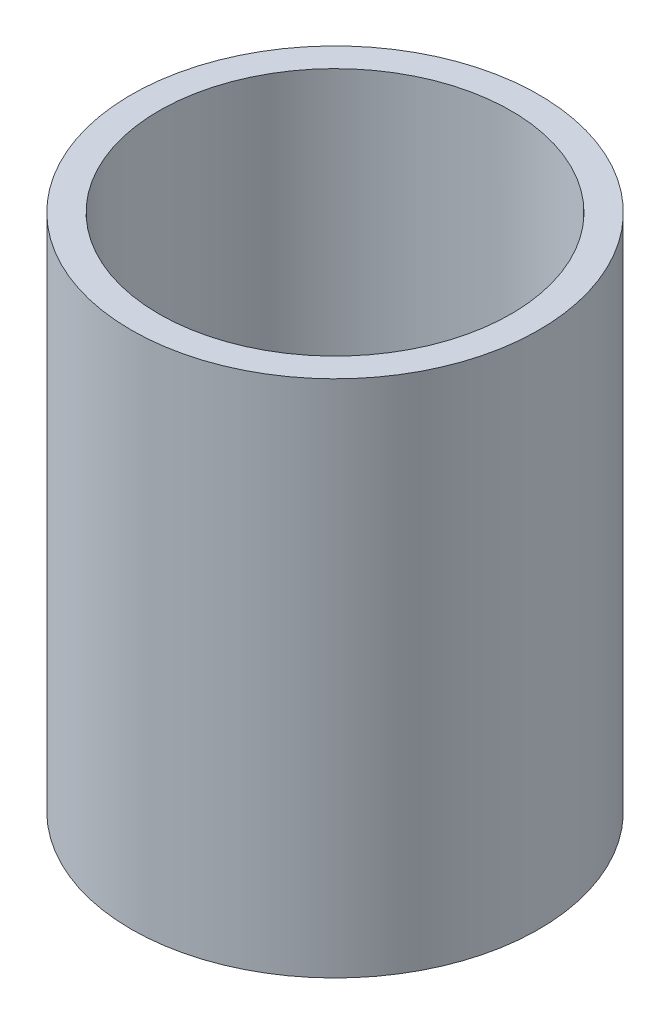
ISO-10303-21;
HEADER;
FILE_DESCRIPTION(('STEP AP214'),'2;1');
FILE_NAME('part.step','',(''),(''),'','','');
FILE_SCHEMA(('AUTOMOTIVE_DESIGN { 1 0 10303 214 1 1 1 1 }'));
ENDSEC;
DATA;
#1=APPLICATION_CONTEXT('core data for automotive mechanical design processes');
#2=APPLICATION_PROTOCOL_DEFINITION('international standard','automotive_design',2000,#1);
#3=PRODUCT_CONTEXT('',#1,'mechanical');
#4=PRODUCT('Part','Part','',(#3));
#5=PRODUCT_RELATED_PRODUCT_CATEGORY('part','',(#4));
#6=PRODUCT_DEFINITION_FORMATION('','',#4);
#7=PRODUCT_DEFINITION_CONTEXT('part definition',#1,'design');
#8=PRODUCT_DEFINITION('design','',#6,#7);
#9=PRODUCT_DEFINITION_SHAPE('','',#8);
#10=(LENGTH_UNIT() NAMED_UNIT(*) SI_UNIT(.MILLI.,.METRE.));
#11=(NAMED_UNIT(*) PLANE_ANGLE_UNIT() SI_UNIT($,.RADIAN.));
#12=(NAMED_UNIT(*) SI_UNIT($,.STERADIAN.) SOLID_ANGLE_UNIT());
#13=UNCERTAINTY_MEASURE_WITH_UNIT(LENGTH_MEASURE(1.E-05),#10,'distance_accuracy_value','');
#14=(GEOMETRIC_REPRESENTATION_CONTEXT(3) GLOBAL_UNCERTAINTY_ASSIGNED_CONTEXT((#13)) GLOBAL_UNIT_ASSIGNED_CONTEXT((#10,
#11,#12)) REPRESENTATION_CONTEXT('',''));
#15=CARTESIAN_POINT('',(0.,0.,0.));
#16=DIRECTION('',(0.,0.,1.));
#17=DIRECTION('',(1.,0.,0.));
#18=AXIS2_PLACEMENT_3D('',#15,#16,#17);
#19=CARTESIAN_POINT('',(0.,14.,0.));
#20=DIRECTION('',(0.,1.,0.));
#21=DIRECTION('',(0.,0.,1.));
#22=AXIS2_PLACEMENT_3D('',#19,#20,#21);
#23=PLANE('',#22);
#24=CARTESIAN_POINT('',(0.,14.,0.));
#25=DIRECTION('',(0.,1.,0.));
#26=DIRECTION('',(0.,0.,1.));
#27=AXIS2_PLACEMENT_3D('',#24,#25,#26);
#28=CIRCLE('',#27,11.);
#29=CARTESIAN_POINT('',(0.,14.,11.));
#30=VERTEX_POINT('',#29);
#31=EDGE_CURVE('E10',#30,#30,#28,.T.);
#32=ORIENTED_EDGE('',*,*,#31,.T.);
#33=EDGE_LOOP('',(#32));
#34=FACE_BOUND('',#33,.T.);
#35=CARTESIAN_POINT('',(0.,14.,0.));
#36=DIRECTION('',(0.,1.,0.));
#37=DIRECTION('',(0.,0.,1.));
#38=AXIS2_PLACEMENT_3D('',#35,#36,#37);
#39=CIRCLE('',#38,9.5);
#40=CARTESIAN_POINT('',(0.,14.,9.5));
#41=VERTEX_POINT('',#40);
#42=EDGE_CURVE('E50',#41,#41,#39,.T.);
#43=ORIENTED_EDGE('',*,*,#42,.F.);
#44=EDGE_LOOP('',(#43));
#45=FACE_BOUND('',#44,.T.);
#46=ADVANCED_FACE('F31',(#34,#45),#23,.T.);
#47=CARTESIAN_POINT('',(0.,-14.,0.));
#48=DIRECTION('',(0.,1.,0.));
#49=DIRECTION('',(0.,0.,1.));
#50=AXIS2_PLACEMENT_3D('',#47,#48,#49);
#51=PLANE('',#50);
#52=CARTESIAN_POINT('',(0.,-14.,0.));
#53=DIRECTION('',(0.,1.,0.));
#54=DIRECTION('',(0.,0.,1.));
#55=AXIS2_PLACEMENT_3D('',#52,#53,#54);
#56=CIRCLE('',#55,11.);
#57=CARTESIAN_POINT('',(0.,-14.,11.));
#58=VERTEX_POINT('',#57);
#59=EDGE_CURVE('E45',#58,#58,#56,.T.);
#60=ORIENTED_EDGE('',*,*,#59,.F.);
#61=EDGE_LOOP('',(#60));
#62=FACE_BOUND('',#61,.T.);
#63=CARTESIAN_POINT('',(0.,-14.,0.));
#64=DIRECTION('',(0.,1.,0.));
#65=DIRECTION('',(0.,0.,1.));
#66=AXIS2_PLACEMENT_3D('',#63,#64,#65);
#67=CIRCLE('',#66,9.5);
#68=CARTESIAN_POINT('',(0.,-14.,9.5));
#69=VERTEX_POINT('',#68);
#70=EDGE_CURVE('E52',#69,#69,#67,.T.);
#71=ORIENTED_EDGE('',*,*,#70,.T.);
#72=EDGE_LOOP('',(#71));
#73=FACE_BOUND('',#72,.T.);
#74=ADVANCED_FACE('F73',(#62,#73),#51,.F.);
#75=CARTESIAN_POINT('',(0.,14.,0.));
#76=DIRECTION('',(0.,-1.,0.));
#77=DIRECTION('',(0.,0.,-1.));
#78=AXIS2_PLACEMENT_3D('',#75,#76,#77);
#79=CYLINDRICAL_SURFACE('',#78,11.);
#80=CARTESIAN_POINT('',(0.,2.,-11.));
#81=CARTESIAN_POINT('',(-0.111357271644373,1.99999568133932,-10.9999980072786));
#82=CARTESIAN_POINT('',(-0.222771449918202,1.99066824251735,-10.9982915273343));
#83=CARTESIAN_POINT('',(-0.442464406848309,1.95362653397508,-10.99164847502));
#84=CARTESIAN_POINT('',(-0.550740387266074,1.92589635141863,-10.9867091072254));
#85=CARTESIAN_POINT('',(-0.760947572513747,1.85292287032901,-10.9741532323507));
#86=CARTESIAN_POINT('',(-0.862884263930176,1.80769496781024,-10.9665390793192));
#87=CARTESIAN_POINT('',(-1.0577120033845,1.70105266880821,-10.949466714983));
#88=CARTESIAN_POINT('',(-1.15060386767904,1.63963973481181,-10.9400086703132));
#89=CARTESIAN_POINT('',(-1.32576444051238,1.50163409035729,-10.9201743349983));
#90=CARTESIAN_POINT('',(-1.40791622603346,1.42489415801924,-10.9097897259708));
#91=CARTESIAN_POINT('',(-1.55825357341079,1.25872964591017,-10.8893349521181));
#92=CARTESIAN_POINT('',(-1.62643816794977,1.16930418831085,-10.8792648091126));
#93=CARTESIAN_POINT('',(-1.74738695016477,0.979487270540227,-10.8604984020977));
#94=CARTESIAN_POINT('',(-1.80003313265556,0.879019464769625,-10.851812871101));
#95=CARTESIAN_POINT('',(-1.88765546949978,0.670481349676033,-10.836915832769));
#96=CARTESIAN_POINT('',(-1.92263305283275,0.562411655974962,-10.8307041253674));
#97=CARTESIAN_POINT('',(-1.97355197711315,0.342985350643402,-10.8215415351671));
#98=CARTESIAN_POINT('',(-1.98969666425445,0.231677408290375,-10.8185558462234));
#99=CARTESIAN_POINT('',(-2.00312248736688,0.0078955926854322,-10.8160783143231));
#100=CARTESIAN_POINT('',(-2.00040521296643,-0.104578181516031,-10.8165861769405));
#101=CARTESIAN_POINT('',(-1.97634934427,-0.326031914133018,-10.8210066504918));
#102=CARTESIAN_POINT('',(-1.95524117699072,-0.435037867895722,-10.8248771281426));
#103=CARTESIAN_POINT('',(-1.89536523340026,-0.647935018367165,-10.8355206127391));
#104=CARTESIAN_POINT('',(-1.85659674743188,-0.75182600935179,-10.8422937363232));
#105=CARTESIAN_POINT('',(-1.76227297789295,-0.952222790778736,-10.8580238155272));
#106=CARTESIAN_POINT('',(-1.7066239037154,-1.04868344266613,-10.8669929171435));
#107=CARTESIAN_POINT('',(-1.58018503374043,-1.23098473694529,-10.8860962201172));
#108=CARTESIAN_POINT('',(-1.50939379023584,-1.31682436264624,-10.8962305328347));
#109=CARTESIAN_POINT('',(-1.35343399418352,-1.47677899644437,-10.9167064080854));
#110=CARTESIAN_POINT('',(-1.2680681726569,-1.55070168843691,-10.9270488181647));
#111=CARTESIAN_POINT('',(-1.08604454069331,-1.68320513348083,-10.9466375043709));
#112=CARTESIAN_POINT('',(-0.989386629498157,-1.74178574962126,-10.9558837707156));
#113=CARTESIAN_POINT('',(-0.787327598497296,-1.84196738978503,-10.9722553782534));
#114=CARTESIAN_POINT('',(-0.681916780395492,-1.88354926869598,-10.9793783255922));
#115=CARTESIAN_POINT('',(-0.465448414462666,-1.9483631924937,-10.9906820547088));
#116=CARTESIAN_POINT('',(-0.354391431316065,-1.97159706857391,-10.994863130091));
#117=CARTESIAN_POINT('',(-0.131438649578499,-1.99878976191912,-10.9997719337866));
#118=CARTESIAN_POINT('',(-0.0195760121089339,-2.00301222345408,-11.0005468934114));
#119=CARTESIAN_POINT('',(0.203257238970967,-1.99276820181851,-10.998686302475));
#120=CARTESIAN_POINT('',(0.314227893453082,-1.97830257992826,-10.9960509090871));
#121=CARTESIAN_POINT('',(0.531297097592757,-1.93131225043812,-10.9876950863245));
#122=CARTESIAN_POINT('',(0.637425297458317,-1.89892013081717,-10.9819973157216));
#123=CARTESIAN_POINT('',(0.84274471375661,-1.81713917147806,-10.9681529512222));
#124=CARTESIAN_POINT('',(0.941935480960949,-1.7677492323023,-10.9600061989244));
#125=CARTESIAN_POINT('',(1.13169524707493,-1.65278536219707,-10.9420497958484));
#126=CARTESIAN_POINT('',(1.22216445208488,-1.58704931284408,-10.932223816146));
#127=CARTESIAN_POINT('',(1.39088213822347,-1.4414796233289,-10.9120428807109));
#128=CARTESIAN_POINT('',(1.46912954974332,-1.36164475058806,-10.901687878785));
#129=CARTESIAN_POINT('',(1.6121773788768,-1.1889531185515,-10.8814603955764));
#130=CARTESIAN_POINT('',(1.67679836741418,-1.09594669347414,-10.8715955212189));
#131=CARTESIAN_POINT('',(1.78949986552014,-0.900243818593513,-10.8536151008102));
#132=CARTESIAN_POINT('',(1.83758096630795,-0.797547715315616,-10.8454994922354));
#133=CARTESIAN_POINT('',(1.91557945241746,-0.585849250308254,-10.8319954461548));
#134=CARTESIAN_POINT('',(1.9455810786184,-0.476878769261946,-10.8265943801675));
#135=CARTESIAN_POINT('',(1.98683040178554,-0.255337011368931,-10.8191012654539));
#136=CARTESIAN_POINT('',(1.99808007453629,-0.142766115151078,-10.8170088681136));
#137=CARTESIAN_POINT('',(2.00144313663184,0.0809853754636368,-10.8163869388262));
#138=CARTESIAN_POINT('',(1.99383937001232,0.192161671438542,-10.8178047454411));
#139=CARTESIAN_POINT('',(1.96032846912815,0.411623638017415,-10.8239270874703));
#140=CARTESIAN_POINT('',(1.93442142905718,0.519909323494285,-10.8286316059701));
#141=CARTESIAN_POINT('',(1.86515567158476,0.73037619739537,-10.8407757208091));
#142=CARTESIAN_POINT('',(1.82182581019232,0.832567160223432,-10.8482107929975));
#143=CARTESIAN_POINT('',(1.71897473664823,1.02827444716474,-10.8649817751485));
#144=CARTESIAN_POINT('',(1.65945247569007,1.12179020884559,-10.8743178082294));
#145=CARTESIAN_POINT('',(1.52491543662799,1.29891287459562,-10.8940032465147));
#146=CARTESIAN_POINT('',(1.44969415553099,1.38236156987076,-10.9043650783111));
#147=CARTESIAN_POINT('',(1.28632651423364,1.53554708101219,-10.9248399206865));
#148=CARTESIAN_POINT('',(1.19817718680093,1.60528074039225,-10.9349528735191));
#149=CARTESIAN_POINT('',(1.0105711896463,1.72960029712349,-10.9538897429719));
#150=CARTESIAN_POINT('',(0.911025849790496,1.78405418518013,-10.9627021317343));
#151=CARTESIAN_POINT('',(0.704073905086344,1.87537921607405,-10.9779326099335));
#152=CARTESIAN_POINT('',(0.59667492548667,1.91226715927832,-10.9843529858473));
#153=CARTESIAN_POINT('',(0.407441749458405,1.95977543030219,-10.9927407037649));
#154=CARTESIAN_POINT('',(0.326725427276489,1.97483433296035,-10.9954478027358));
#155=CARTESIAN_POINT('',(0.164016342132202,1.9949480937949,-10.9990781643304));
#156=CARTESIAN_POINT('',(0.0820236084408326,2.00000318104177,-11.0000014678));
#157=CARTESIAN_POINT('',(0.,2.,-11.));
#158=B_SPLINE_CURVE_WITH_KNOTS('',3,(#80,#81,#82,#83,#84,#85,#86,#87,#88,#89,#90,#91,#92,#93,
#94,#95,#96,#97,#98,#99,#100,#101,#102,#103,#104,#105,#106,#107,#108,#109,#110,#111,#112,#113,
#114,#115,#116,#117,#118,#119,#120,#121,#122,#123,#124,#125,#126,#127,#128,#129,#130,#131,#132,
#133,#134,#135,#136,#137,#138,#139,#140,#141,#142,#143,#144,#145,#146,#147,#148,#149,#150,#151,
#152,#153,#154,#155,#156,#157),.UNSPECIFIED.,.T.,.F.,(4,2,2,2,2,2,2,2,2,2,2,2,2,2,2,2,2,2,2,2,2,
2,2,2,2,2,2,2,2,2,2,2,2,2,2,2,2,2,4),(0.,0.333771891552332,0.66783277207259,1.00160038286674,
1.3353378446015,1.67245014596885,2.00958578663078,2.3492195220365,2.6888257845573,
3.02473021172645,3.36060633024202,3.69233367290895,4.02407434678871,4.35769306461625,
4.69134369321255,5.02993210441872,5.36852353704646,5.70749527023812,6.04643316861453,
6.38065600997364,6.71486344850797,7.0466314328543,7.3784208807422,7.71364226795666,
8.04889297616123,8.38831506130458,8.72772501252474,9.06554101076157,9.40332141303601,
9.73606509730371,10.0688070691931,10.4010002025896,10.733214857769,11.0701111453004,
11.4070848782946,11.7468860454293,12.0863615649817,12.3322171022956,12.5780670098676),.UNSPECIFIED.);
#159=CARTESIAN_POINT('',(0.,2.,-11.));
#160=VERTEX_POINT('',#159);
#161=EDGE_CURVE('E55',#160,#160,#158,.T.);
#162=ORIENTED_EDGE('',*,*,#161,.T.);
#163=EDGE_LOOP('',(#162));
#164=FACE_BOUND('',#163,.T.);
#165=ORIENTED_EDGE('',*,*,#31,.F.);
#166=EDGE_LOOP('',(#165));
#167=FACE_BOUND('',#166,.T.);
#168=ORIENTED_EDGE('',*,*,#59,.T.);
#169=EDGE_LOOP('',(#168));
#170=FACE_BOUND('',#169,.T.);
#171=ADVANCED_FACE('F33',(#164,#167,#170),#79,.T.);
#172=CARTESIAN_POINT('',(0.,14.,0.));
#173=DIRECTION('',(0.,-1.,0.));
#174=DIRECTION('',(0.,0.,-1.));
#175=AXIS2_PLACEMENT_3D('',#172,#173,#174);
#176=CYLINDRICAL_SURFACE('',#175,9.5);
#177=CARTESIAN_POINT('',(0.,2.,-9.5));
#178=CARTESIAN_POINT('',(-0.111027691406918,1.99999607124184,-9.49999794466284));
#179=CARTESIAN_POINT('',(-0.222103819697907,1.99072341258494,-9.49803374011152));
#180=CARTESIAN_POINT('',(-0.441107897677741,1.95391221577522,-9.49038773876543));
#181=CARTESIAN_POINT('',(-0.54903342154803,1.92635997129166,-9.48470315241122));
#182=CARTESIAN_POINT('',(-0.75853895435663,1.85388532469072,-9.47025014436966));
#183=CARTESIAN_POINT('',(-0.860125227252474,1.80898039524809,-9.46148482551806));
#184=CARTESIAN_POINT('',(-1.05431669556347,1.70312896009559,-9.44181943917345));
#185=CARTESIAN_POINT('',(-1.14692225767425,1.64218310973783,-9.43091945889674));
#186=CARTESIAN_POINT('',(-1.32191105664779,1.5050163164218,-9.40799939900276));
#187=CARTESIAN_POINT('',(-1.40414098477697,1.42860195147082,-9.39596628673028));
#188=CARTESIAN_POINT('',(-1.5547158009156,1.26308274811662,-9.37222932526175));
#189=CARTESIAN_POINT('',(-1.62305952179986,1.17397684406892,-9.36052550381352));
#190=CARTESIAN_POINT('',(-1.74458761331518,0.984484185953073,-9.33864435582616));
#191=CARTESIAN_POINT('',(-1.79761077433325,0.883991938755634,-9.3284837610875));
#192=CARTESIAN_POINT('',(-1.88595912909311,0.675274801536372,-9.31102569552844));
#193=CARTESIAN_POINT('',(-1.92128627263874,0.567050764929939,-9.30372790929388));
#194=CARTESIAN_POINT('',(-1.97273711798376,0.347599187936316,-9.29295410063532));
#195=CARTESIAN_POINT('',(-1.98913117149676,0.236437726029861,-9.28942433018121));
#196=CARTESIAN_POINT('',(-2.00309070126667,0.0128904097218121,-9.28642462929545));
#197=CARTESIAN_POINT('',(-2.0006583162811,-0.0994953041514232,-9.28695423770231));
#198=CARTESIAN_POINT('',(-1.97725203465241,-0.320305456881873,-9.29196471678557));
#199=CARTESIAN_POINT('',(-1.95659032965632,-0.428764725492339,-9.29637905513068));
#200=CARTESIAN_POINT('',(-1.89780570602233,-0.640642213120638,-9.30855661318396));
#201=CARTESIAN_POINT('',(-1.85968187273537,-0.744060167765434,-9.31632000831117));
#202=CARTESIAN_POINT('',(-1.76676342524457,-0.943806884131072,-9.3343876042841));
#203=CARTESIAN_POINT('',(-1.71184711583088,-1.04007729828671,-9.34471024508934));
#204=CARTESIAN_POINT('',(-1.58698828724243,-1.22215279263024,-9.36672168799341));
#205=CARTESIAN_POINT('',(-1.51704386320572,-1.3079565439714,-9.37841066319381));
#206=CARTESIAN_POINT('',(-1.36245319268555,-1.4684622817483,-9.40212443418224));
#207=CARTESIAN_POINT('',(-1.27754103078861,-1.54290808627708,-9.41415127237563));
#208=CARTESIAN_POINT('',(-1.09630350618647,-1.67654250571492,-9.43697235772124));
#209=CARTESIAN_POINT('',(-0.999977965203844,-1.73573088225649,-9.44776658561488));
#210=CARTESIAN_POINT('',(-0.798347946602957,-1.83722642932747,-9.4669373217246));
#211=CARTESIAN_POINT('',(-0.69302708048702,-1.87950195453674,-9.47530928967255));
#212=CARTESIAN_POINT('',(-0.476561722422705,-1.94568588832717,-9.48865817597072));
#213=CARTESIAN_POINT('',(-0.365418015870041,-1.9695967671881,-9.49363555092699));
#214=CARTESIAN_POINT('',(-0.142661179143838,-1.99800450639615,-9.49957007213675));
#215=CARTESIAN_POINT('',(-0.0310945881093405,-2.0028515971632,-9.50059973479178));
#216=CARTESIAN_POINT('',(0.191254168004883,-1.99394073033466,-9.49872522451051));
#217=CARTESIAN_POINT('',(0.302036381746438,-1.98018393725046,-9.49582129779749));
#218=CARTESIAN_POINT('',(0.518524951939024,-1.93474649592577,-9.48645148769872));
#219=CARTESIAN_POINT('',(0.624271191689803,-1.9032477568752,-9.48002177185877));
#220=CARTESIAN_POINT('',(0.828980163564159,-1.82342106378551,-9.46431934896414));
#221=CARTESIAN_POINT('',(0.927942347168736,-1.77509175084118,-9.45504641235425));
#222=CARTESIAN_POINT('',(1.1177352139125,-1.66223358719176,-9.43450639350327));
#223=CARTESIAN_POINT('',(1.20843942082223,-1.59749669396346,-9.42321429613729));
#224=CARTESIAN_POINT('',(1.3778228093732,-1.4539370145307,-9.39994292264559));
#225=CARTESIAN_POINT('',(1.45650054987901,-1.37511254265818,-9.38796356440136));
#226=CARTESIAN_POINT('',(1.60096761890465,-1.2040136422456,-9.36442002668555));
#227=CARTESIAN_POINT('',(1.66651533299618,-1.11153350144117,-9.35286635532256));
#228=CARTESIAN_POINT('',(1.78114871532168,-0.916670780701587,-9.3317158615554));
#229=CARTESIAN_POINT('',(1.83023507526624,-0.814288617085105,-9.32211895693401));
#230=CARTESIAN_POINT('',(1.91023404895235,-0.603064952859253,-9.30605568943114));
#231=CARTESIAN_POINT('',(1.94124569603787,-0.494262317804471,-9.29957230236649));
#232=CARTESIAN_POINT('',(1.98450997561557,-0.272837680684516,-9.29043690813401));
#233=CARTESIAN_POINT('',(1.99676535636039,-0.160216240640175,-9.2877843396606));
#234=CARTESIAN_POINT('',(2.00205901839309,0.0632177269963566,-9.28664441918933));
#235=CARTESIAN_POINT('',(1.99547977904066,0.174020943674142,-9.28807416506268));
#236=CARTESIAN_POINT('',(1.96414112828371,0.392902569944553,-9.29475130102582));
#237=CARTESIAN_POINT('',(1.93938189936145,0.500981006875987,-9.29999865279627));
#238=CARTESIAN_POINT('',(1.87256463307709,0.711068384555116,-9.31368082515299));
#239=CARTESIAN_POINT('',(1.83055834216923,0.813094445199553,-9.32210610488688));
#240=CARTESIAN_POINT('',(1.7304853373043,1.00870903307655,-9.34119928093713));
#241=CARTESIAN_POINT('',(1.67241709412298,1.10229675578741,-9.35186739076535));
#242=CARTESIAN_POINT('',(1.54058300352461,1.28027215313688,-9.37449454781844));
#243=CARTESIAN_POINT('',(1.46654292423916,1.36445412742038,-9.38647407045747));
#244=CARTESIAN_POINT('',(1.30542742412966,1.51932471088921,-9.41023256612317));
#245=CARTESIAN_POINT('',(1.21834900426412,1.59001020712048,-9.42201149231316));
#246=CARTESIAN_POINT('',(1.0323889870608,1.71667699825411,-9.44420645110714));
#247=CARTESIAN_POINT('',(0.93337998435434,1.77247451681065,-9.45460471891947));
#248=CARTESIAN_POINT('',(0.727194538068346,1.86654901797897,-9.47269018370409));
#249=CARTESIAN_POINT('',(0.620025269870787,1.90484119029407,-9.48037972974824));
#250=CARTESIAN_POINT('',(0.427239257105933,1.95572669428031,-9.49075437069452));
#251=CARTESIAN_POINT('',(0.342690900679509,1.97229845081316,-9.4942005429971));
#252=CARTESIAN_POINT('',(0.172104693356145,1.99443641509507,-9.49882411071615));
#253=CARTESIAN_POINT('',(0.0860668997910726,2.00000304551082,-9.50000159326466));
#254=CARTESIAN_POINT('',(0.,2.,-9.5));
#255=B_SPLINE_CURVE_WITH_KNOTS('',3,(#177,#178,#179,#180,#181,#182,#183,#184,#185,#186,#187,
#188,#189,#190,#191,#192,#193,#194,#195,#196,#197,#198,#199,#200,#201,#202,#203,#204,#205,#206,
#207,#208,#209,#210,#211,#212,#213,#214,#215,#216,#217,#218,#219,#220,#221,#222,#223,#224,#225,
#226,#227,#228,#229,#230,#231,#232,#233,#234,#235,#236,#237,#238,#239,#240,#241,#242,#243,#244,
#245,#246,#247,#248,#249,#250,#251,#252,#253,#254),.UNSPECIFIED.,.T.,.F.,(4,2,2,2,2,2,2,2,2,2,2,
2,2,2,2,2,2,2,2,2,2,2,2,2,2,2,2,2,2,2,2,2,2,2,2,2,2,2,4),(0.,0.332768117031277,
0.665786031430695,0.998469495255918,1.33113936940165,1.6682591973254,2.00540734820485,
2.34598369082386,2.68652249939278,3.02213605752824,3.35771148920196,3.68764911424787,
4.01760402307771,4.3500091841841,4.68245650359801,5.02154876866119,5.36064633105724,
5.7003754379772,6.04005883898082,6.37347176163493,6.7068638152502,7.03689822691305,
7.36695929182639,7.70143535229663,8.03595146177539,8.37614947767226,8.71633319656386,
9.05463505055366,9.39288733028467,9.7243196575421,10.0557486580815,10.3861904535976,
10.7166637206083,11.0533410961237,11.3900960325031,11.7308334079191,12.0712745555643,
12.329241012877,12.5871975624483),.UNSPECIFIED.);
#256=CARTESIAN_POINT('',(0.,2.,-9.5));
#257=VERTEX_POINT('',#256);
#258=EDGE_CURVE('E36',#257,#257,#255,.T.);
#259=ORIENTED_EDGE('',*,*,#258,.F.);
#260=EDGE_LOOP('',(#259));
#261=FACE_BOUND('',#260,.T.);
#262=ORIENTED_EDGE('',*,*,#42,.T.);
#263=EDGE_LOOP('',(#262));
#264=FACE_BOUND('',#263,.T.);
#265=ORIENTED_EDGE('',*,*,#70,.F.);
#266=EDGE_LOOP('',(#265));
#267=FACE_BOUND('',#266,.T.);
#268=ADVANCED_FACE('F65',(#261,#264,#267),#176,.F.);
#269=CARTESIAN_POINT('',(0.,0.,-28.));
#270=DIRECTION('',(0.,0.,1.));
#271=DIRECTION('',(1.,0.,0.));
#272=AXIS2_PLACEMENT_3D('',#269,#270,#271);
#273=CYLINDRICAL_SURFACE('',#272,2.);
#274=ORIENTED_EDGE('',*,*,#258,.T.);
#275=EDGE_LOOP('',(#274));
#276=FACE_BOUND('',#275,.T.);
#277=ORIENTED_EDGE('',*,*,#161,.F.);
#278=EDGE_LOOP('',(#277));
#279=FACE_BOUND('',#278,.T.);
#280=ADVANCED_FACE('F62',(#276,#279),#273,.F.);
#281=CLOSED_SHELL('',(#46,#74,#171,#268,#280));
#282=MANIFOLD_SOLID_BREP('B2',#281);
#283=ADVANCED_BREP_SHAPE_REPRESENTATION('',(#18,#282),#14);
#284=SHAPE_DEFINITION_REPRESENTATION(#9,#283);
ENDSEC;
END-ISO-10303-21;
